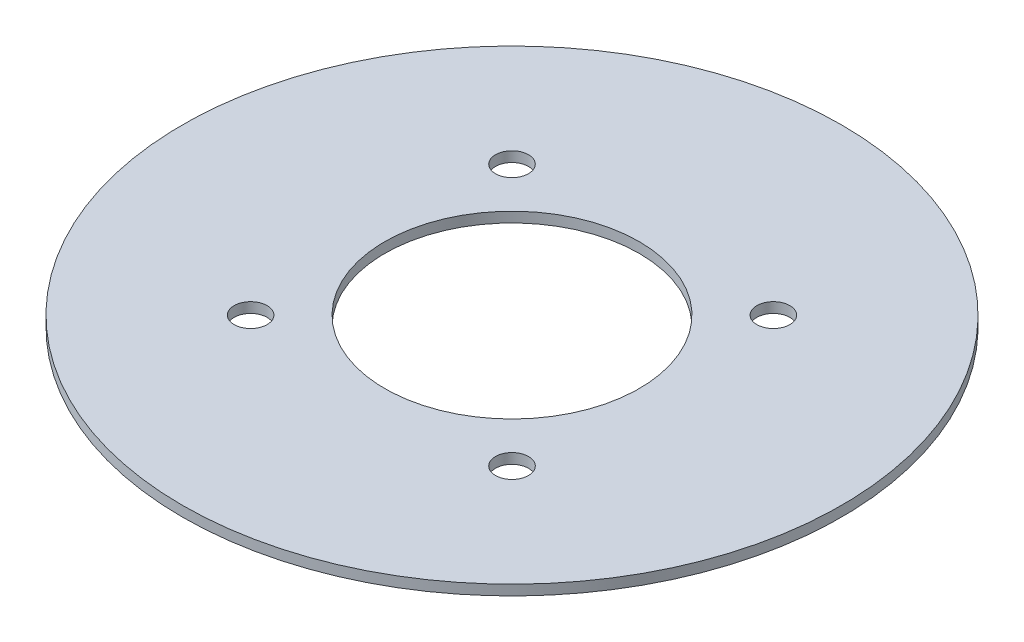
ISO-10303-21;
HEADER;
FILE_DESCRIPTION(('STEP AP214'),'2;1');
FILE_NAME('part.step','',(''),(''),'','','');
FILE_SCHEMA(('AUTOMOTIVE_DESIGN { 1 0 10303 214 1 1 1 1 }'));
ENDSEC;
DATA;
#1=APPLICATION_CONTEXT('core data for automotive mechanical design processes');
#2=APPLICATION_PROTOCOL_DEFINITION('international standard','automotive_design',2000,#1);
#3=PRODUCT_CONTEXT('',#1,'mechanical');
#4=PRODUCT('Part','Part','',(#3));
#5=PRODUCT_RELATED_PRODUCT_CATEGORY('part','',(#4));
#6=PRODUCT_DEFINITION_FORMATION('','',#4);
#7=PRODUCT_DEFINITION_CONTEXT('part definition',#1,'design');
#8=PRODUCT_DEFINITION('design','',#6,#7);
#9=PRODUCT_DEFINITION_SHAPE('','',#8);
#10=(LENGTH_UNIT() NAMED_UNIT(*) SI_UNIT(.MILLI.,.METRE.));
#11=(NAMED_UNIT(*) PLANE_ANGLE_UNIT() SI_UNIT($,.RADIAN.));
#12=(NAMED_UNIT(*) SI_UNIT($,.STERADIAN.) SOLID_ANGLE_UNIT());
#13=UNCERTAINTY_MEASURE_WITH_UNIT(LENGTH_MEASURE(1.E-05),#10,'distance_accuracy_value','');
#14=(GEOMETRIC_REPRESENTATION_CONTEXT(3) GLOBAL_UNCERTAINTY_ASSIGNED_CONTEXT((#13)) GLOBAL_UNIT_ASSIGNED_CONTEXT((#10,
#11,#12)) REPRESENTATION_CONTEXT('',''));
#15=CARTESIAN_POINT('',(0.,0.,0.));
#16=DIRECTION('',(0.,0.,1.));
#17=DIRECTION('',(1.,0.,0.));
#18=AXIS2_PLACEMENT_3D('',#15,#16,#17);
#19=CARTESIAN_POINT('',(0.,603.103613164921,0.));
#20=DIRECTION('',(0.,1.,0.));
#21=DIRECTION('',(0.,0.,1.));
#22=AXIS2_PLACEMENT_3D('',#19,#20,#21);
#23=CYLINDRICAL_SURFACE('',#22,29.);
#24=CARTESIAN_POINT('',(0.,603.103613164921,0.));
#25=DIRECTION('',(0.,-1.,0.));
#26=DIRECTION('',(0.,0.,-1.));
#27=AXIS2_PLACEMENT_3D('',#24,#25,#26);
#28=CIRCLE('',#27,29.);
#29=CARTESIAN_POINT('',(0.,603.103613164921,-29.));
#30=VERTEX_POINT('',#29);
#31=EDGE_CURVE('E10',#30,#30,#28,.T.);
#32=ORIENTED_EDGE('',*,*,#31,.F.);
#33=EDGE_LOOP('',(#32));
#34=FACE_BOUND('',#33,.T.);
#35=CARTESIAN_POINT('',(0.,604.003613164921,0.));
#36=DIRECTION('',(0.,-1.,0.));
#37=DIRECTION('',(0.,0.,-1.));
#38=AXIS2_PLACEMENT_3D('',#35,#36,#37);
#39=CIRCLE('',#38,29.);
#40=CARTESIAN_POINT('',(0.,604.003613164921,-29.));
#41=VERTEX_POINT('',#40);
#42=EDGE_CURVE('E42',#41,#41,#39,.T.);
#43=ORIENTED_EDGE('',*,*,#42,.T.);
#44=EDGE_LOOP('',(#43));
#45=FACE_BOUND('',#44,.T.);
#46=ADVANCED_FACE('F39',(#34,#45),#23,.T.);
#47=CARTESIAN_POINT('',(0.,603.103613164921,0.));
#48=DIRECTION('',(0.,-1.,0.));
#49=DIRECTION('',(0.,0.,-1.));
#50=AXIS2_PLACEMENT_3D('',#47,#48,#49);
#51=PLANE('',#50);
#52=CARTESIAN_POINT('',(-11.5,603.103613164921,-11.5));
#53=DIRECTION('',(0.,-1.,0.));
#54=DIRECTION('',(0.,0.,-1.));
#55=AXIS2_PLACEMENT_3D('',#52,#53,#54);
#56=CIRCLE('',#55,1.45);
#57=CARTESIAN_POINT('',(-11.5,603.103613164921,-12.95));
#58=VERTEX_POINT('',#57);
#59=EDGE_CURVE('E54',#58,#58,#56,.T.);
#60=ORIENTED_EDGE('',*,*,#59,.F.);
#61=EDGE_LOOP('',(#60));
#62=FACE_BOUND('',#61,.T.);
#63=CARTESIAN_POINT('',(11.5,603.103613164921,11.5));
#64=DIRECTION('',(0.,-1.,0.));
#65=DIRECTION('',(0.,0.,-1.));
#66=AXIS2_PLACEMENT_3D('',#63,#64,#65);
#67=CIRCLE('',#66,1.45);
#68=CARTESIAN_POINT('',(11.5,603.103613164921,10.05));
#69=VERTEX_POINT('',#68);
#70=EDGE_CURVE('E60',#69,#69,#67,.T.);
#71=ORIENTED_EDGE('',*,*,#70,.F.);
#72=EDGE_LOOP('',(#71));
#73=FACE_BOUND('',#72,.T.);
#74=CARTESIAN_POINT('',(0.,603.103613164921,0.));
#75=DIRECTION('',(0.,-1.,0.));
#76=DIRECTION('',(0.,0.,-1.));
#77=AXIS2_PLACEMENT_3D('',#74,#75,#76);
#78=CIRCLE('',#77,11.2);
#79=CARTESIAN_POINT('',(0.,603.103613164921,-11.2));
#80=VERTEX_POINT('',#79);
#81=EDGE_CURVE('E72',#80,#80,#78,.T.);
#82=ORIENTED_EDGE('',*,*,#81,.F.);
#83=EDGE_LOOP('',(#82));
#84=FACE_BOUND('',#83,.T.);
#85=CARTESIAN_POINT('',(-11.5,603.103613164921,11.5));
#86=DIRECTION('',(0.,-1.,0.));
#87=DIRECTION('',(0.,0.,-1.));
#88=AXIS2_PLACEMENT_3D('',#85,#86,#87);
#89=CIRCLE('',#88,1.45);
#90=CARTESIAN_POINT('',(-11.5,603.103613164921,10.05));
#91=VERTEX_POINT('',#90);
#92=EDGE_CURVE('E61',#91,#91,#89,.T.);
#93=ORIENTED_EDGE('',*,*,#92,.F.);
#94=EDGE_LOOP('',(#93));
#95=FACE_BOUND('',#94,.T.);
#96=CARTESIAN_POINT('',(11.5,603.103613164921,-11.5));
#97=DIRECTION('',(0.,-1.,0.));
#98=DIRECTION('',(0.,0.,-1.));
#99=AXIS2_PLACEMENT_3D('',#96,#97,#98);
#100=CIRCLE('',#99,1.45);
#101=CARTESIAN_POINT('',(11.5,603.103613164921,-12.95));
#102=VERTEX_POINT('',#101);
#103=EDGE_CURVE('E51',#102,#102,#100,.T.);
#104=ORIENTED_EDGE('',*,*,#103,.F.);
#105=EDGE_LOOP('',(#104));
#106=FACE_BOUND('',#105,.T.);
#107=ORIENTED_EDGE('',*,*,#31,.T.);
#108=EDGE_LOOP('',(#107));
#109=FACE_BOUND('',#108,.T.);
#110=ADVANCED_FACE('F83',(#62,#73,#84,#95,#106,#109),#51,.T.);
#111=CARTESIAN_POINT('',(0.,604.003613164921,0.));
#112=DIRECTION('',(0.,-1.,0.));
#113=DIRECTION('',(0.,0.,-1.));
#114=AXIS2_PLACEMENT_3D('',#111,#112,#113);
#115=PLANE('',#114);
#116=CARTESIAN_POINT('',(-11.5,604.003613164921,-11.5));
#117=DIRECTION('',(0.,-1.,0.));
#118=DIRECTION('',(0.,0.,-1.));
#119=AXIS2_PLACEMENT_3D('',#116,#117,#118);
#120=CIRCLE('',#119,1.45);
#121=CARTESIAN_POINT('',(-11.5,604.003613164921,-12.95));
#122=VERTEX_POINT('',#121);
#123=EDGE_CURVE('E64',#122,#122,#120,.T.);
#124=ORIENTED_EDGE('',*,*,#123,.T.);
#125=EDGE_LOOP('',(#124));
#126=FACE_BOUND('',#125,.T.);
#127=CARTESIAN_POINT('',(11.5,604.003613164921,11.5));
#128=DIRECTION('',(0.,-1.,0.));
#129=DIRECTION('',(0.,0.,-1.));
#130=AXIS2_PLACEMENT_3D('',#127,#128,#129);
#131=CIRCLE('',#130,1.45);
#132=CARTESIAN_POINT('',(11.5,604.003613164921,10.05));
#133=VERTEX_POINT('',#132);
#134=EDGE_CURVE('E57',#133,#133,#131,.T.);
#135=ORIENTED_EDGE('',*,*,#134,.T.);
#136=EDGE_LOOP('',(#135));
#137=FACE_BOUND('',#136,.T.);
#138=CARTESIAN_POINT('',(0.,604.003613164921,0.));
#139=DIRECTION('',(0.,-1.,0.));
#140=DIRECTION('',(0.,0.,-1.));
#141=AXIS2_PLACEMENT_3D('',#138,#139,#140);
#142=CIRCLE('',#141,11.2);
#143=CARTESIAN_POINT('',(0.,604.003613164921,-11.2));
#144=VERTEX_POINT('',#143);
#145=EDGE_CURVE('E75',#144,#144,#142,.T.);
#146=ORIENTED_EDGE('',*,*,#145,.T.);
#147=EDGE_LOOP('',(#146));
#148=FACE_BOUND('',#147,.T.);
#149=CARTESIAN_POINT('',(-11.5,604.003613164921,11.5));
#150=DIRECTION('',(0.,-1.,0.));
#151=DIRECTION('',(0.,0.,-1.));
#152=AXIS2_PLACEMENT_3D('',#149,#150,#151);
#153=CIRCLE('',#152,1.45);
#154=CARTESIAN_POINT('',(-11.5,604.003613164921,10.05));
#155=VERTEX_POINT('',#154);
#156=EDGE_CURVE('E69',#155,#155,#153,.T.);
#157=ORIENTED_EDGE('',*,*,#156,.T.);
#158=EDGE_LOOP('',(#157));
#159=FACE_BOUND('',#158,.T.);
#160=CARTESIAN_POINT('',(11.5,604.003613164921,-11.5));
#161=DIRECTION('',(0.,-1.,0.));
#162=DIRECTION('',(0.,0.,-1.));
#163=AXIS2_PLACEMENT_3D('',#160,#161,#162);
#164=CIRCLE('',#163,1.45);
#165=CARTESIAN_POINT('',(11.5,604.003613164921,-12.95));
#166=VERTEX_POINT('',#165);
#167=EDGE_CURVE('E49',#166,#166,#164,.T.);
#168=ORIENTED_EDGE('',*,*,#167,.T.);
#169=EDGE_LOOP('',(#168));
#170=FACE_BOUND('',#169,.T.);
#171=ORIENTED_EDGE('',*,*,#42,.F.);
#172=EDGE_LOOP('',(#171));
#173=FACE_BOUND('',#172,.T.);
#174=ADVANCED_FACE('F86',(#126,#137,#148,#159,#170,#173),#115,.F.);
#175=CARTESIAN_POINT('',(11.5,604.003613164921,-11.5));
#176=DIRECTION('',(0.,-1.,0.));
#177=DIRECTION('',(0.,0.,-1.));
#178=AXIS2_PLACEMENT_3D('',#175,#176,#177);
#179=CYLINDRICAL_SURFACE('',#178,1.45);
#180=ORIENTED_EDGE('',*,*,#167,.F.);
#181=EDGE_LOOP('',(#180));
#182=FACE_BOUND('',#181,.T.);
#183=ORIENTED_EDGE('',*,*,#103,.T.);
#184=EDGE_LOOP('',(#183));
#185=FACE_BOUND('',#184,.T.);
#186=ADVANCED_FACE('F93',(#182,#185),#179,.F.);
#187=CARTESIAN_POINT('',(-11.5,604.003613164921,11.5));
#188=DIRECTION('',(0.,-1.,0.));
#189=DIRECTION('',(0.,0.,-1.));
#190=AXIS2_PLACEMENT_3D('',#187,#188,#189);
#191=CYLINDRICAL_SURFACE('',#190,1.45);
#192=ORIENTED_EDGE('',*,*,#156,.F.);
#193=EDGE_LOOP('',(#192));
#194=FACE_BOUND('',#193,.T.);
#195=ORIENTED_EDGE('',*,*,#92,.T.);
#196=EDGE_LOOP('',(#195));
#197=FACE_BOUND('',#196,.T.);
#198=ADVANCED_FACE('F95',(#194,#197),#191,.F.);
#199=CARTESIAN_POINT('',(0.,604.003613164921,0.));
#200=DIRECTION('',(0.,-1.,0.));
#201=DIRECTION('',(0.,0.,-1.));
#202=AXIS2_PLACEMENT_3D('',#199,#200,#201);
#203=CYLINDRICAL_SURFACE('',#202,11.2);
#204=ORIENTED_EDGE('',*,*,#145,.F.);
#205=EDGE_LOOP('',(#204));
#206=FACE_BOUND('',#205,.T.);
#207=ORIENTED_EDGE('',*,*,#81,.T.);
#208=EDGE_LOOP('',(#207));
#209=FACE_BOUND('',#208,.T.);
#210=ADVANCED_FACE('F81',(#206,#209),#203,.F.);
#211=CARTESIAN_POINT('',(11.5,604.003613164921,11.5));
#212=DIRECTION('',(0.,-1.,0.));
#213=DIRECTION('',(0.,0.,-1.));
#214=AXIS2_PLACEMENT_3D('',#211,#212,#213);
#215=CYLINDRICAL_SURFACE('',#214,1.45);
#216=ORIENTED_EDGE('',*,*,#134,.F.);
#217=EDGE_LOOP('',(#216));
#218=FACE_BOUND('',#217,.T.);
#219=ORIENTED_EDGE('',*,*,#70,.T.);
#220=EDGE_LOOP('',(#219));
#221=FACE_BOUND('',#220,.T.);
#222=ADVANCED_FACE('F144',(#218,#221),#215,.F.);
#223=CARTESIAN_POINT('',(-11.5,604.003613164921,-11.5));
#224=DIRECTION('',(0.,-1.,0.));
#225=DIRECTION('',(0.,0.,-1.));
#226=AXIS2_PLACEMENT_3D('',#223,#224,#225);
#227=CYLINDRICAL_SURFACE('',#226,1.45);
#228=ORIENTED_EDGE('',*,*,#123,.F.);
#229=EDGE_LOOP('',(#228));
#230=FACE_BOUND('',#229,.T.);
#231=ORIENTED_EDGE('',*,*,#59,.T.);
#232=EDGE_LOOP('',(#231));
#233=FACE_BOUND('',#232,.T.);
#234=ADVANCED_FACE('F154',(#230,#233),#227,.F.);
#235=CLOSED_SHELL('',(#46,#110,#174,#186,#198,#210,#222,#234));
#236=MANIFOLD_SOLID_BREP('B2',#235);
#237=ADVANCED_BREP_SHAPE_REPRESENTATION('',(#18,#236),#14);
#238=SHAPE_DEFINITION_REPRESENTATION(#9,#237);
ENDSEC;
END-ISO-10303-21;
